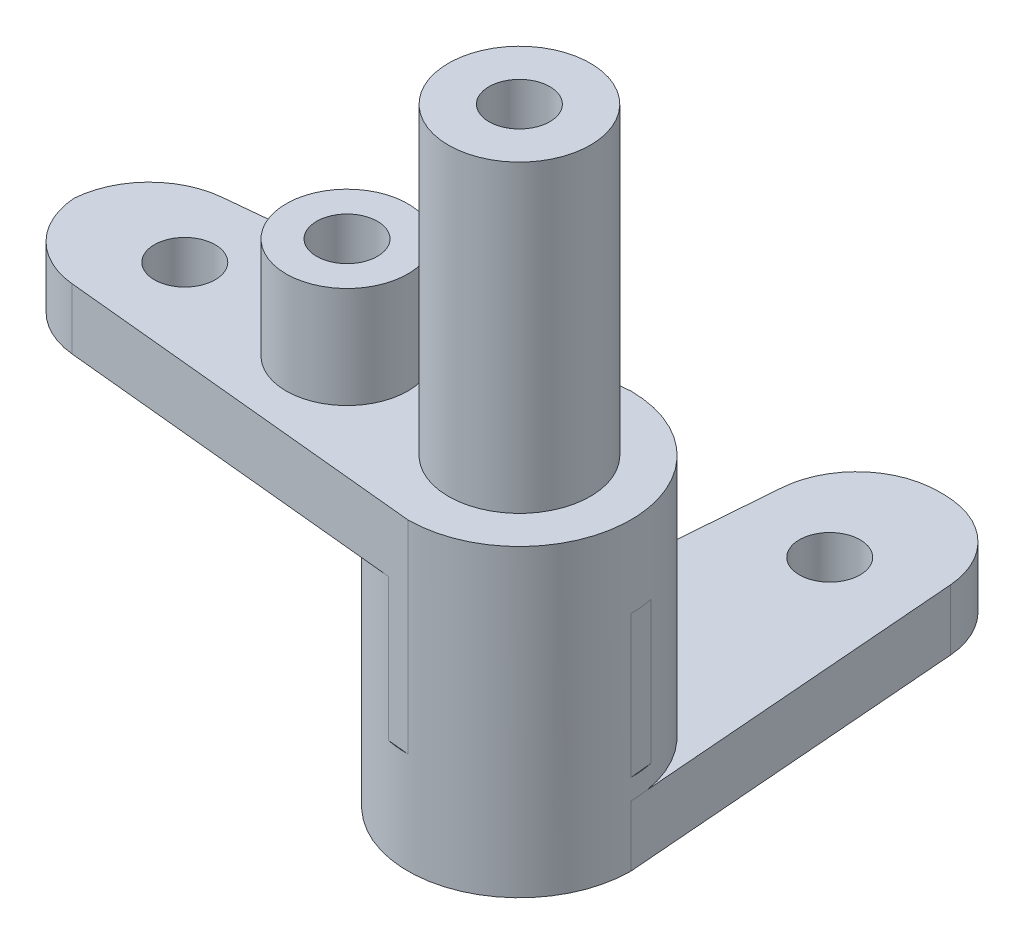
ISO-10303-21;
HEADER;
FILE_DESCRIPTION(('STEP AP214'),'2;1');
FILE_NAME('part.step','',(''),(''),'','','');
FILE_SCHEMA(('AUTOMOTIVE_DESIGN { 1 0 10303 214 1 1 1 1 }'));
ENDSEC;
DATA;
#1=APPLICATION_CONTEXT('core data for automotive mechanical design processes');
#2=APPLICATION_PROTOCOL_DEFINITION('international standard','automotive_design',2000,#1);
#3=PRODUCT_CONTEXT('',#1,'mechanical');
#4=PRODUCT('Part','Part','',(#3));
#5=PRODUCT_RELATED_PRODUCT_CATEGORY('part','',(#4));
#6=PRODUCT_DEFINITION_FORMATION('','',#4);
#7=PRODUCT_DEFINITION_CONTEXT('part definition',#1,'design');
#8=PRODUCT_DEFINITION('design','',#6,#7);
#9=PRODUCT_DEFINITION_SHAPE('','',#8);
#10=(LENGTH_UNIT() NAMED_UNIT(*) SI_UNIT(.MILLI.,.METRE.));
#11=(NAMED_UNIT(*) PLANE_ANGLE_UNIT() SI_UNIT($,.RADIAN.));
#12=(NAMED_UNIT(*) SI_UNIT($,.STERADIAN.) SOLID_ANGLE_UNIT());
#13=UNCERTAINTY_MEASURE_WITH_UNIT(LENGTH_MEASURE(1.E-05),#10,'distance_accuracy_value','');
#14=(GEOMETRIC_REPRESENTATION_CONTEXT(3) GLOBAL_UNCERTAINTY_ASSIGNED_CONTEXT((#13)) GLOBAL_UNIT_ASSIGNED_CONTEXT((#10,
#11,#12)) REPRESENTATION_CONTEXT('',''));
#15=CARTESIAN_POINT('',(0.,0.,0.));
#16=DIRECTION('',(0.,0.,1.));
#17=DIRECTION('',(1.,0.,0.));
#18=AXIS2_PLACEMENT_3D('',#15,#16,#17);
#19=CARTESIAN_POINT('',(16.5,18.,0.));
#20=DIRECTION('',(0.,-1.,0.));
#21=DIRECTION('',(0.,0.,-1.));
#22=AXIS2_PLACEMENT_3D('',#19,#20,#21);
#23=CYLINDRICAL_SURFACE('',#22,2.);
#24=CARTESIAN_POINT('',(16.5,-8.,0.));
#25=DIRECTION('',(0.,-1.,0.));
#26=DIRECTION('',(0.,0.,-1.));
#27=AXIS2_PLACEMENT_3D('',#24,#25,#26);
#28=CIRCLE('',#27,2.);
#29=CARTESIAN_POINT('',(16.5,-8.,-2.));
#30=VERTEX_POINT('',#29);
#31=EDGE_CURVE('E186',#30,#30,#28,.T.);
#32=ORIENTED_EDGE('',*,*,#31,.T.);
#33=EDGE_LOOP('',(#32));
#34=FACE_BOUND('',#33,.T.);
#35=CARTESIAN_POINT('',(16.5,-3.,0.));
#36=DIRECTION('',(0.,1.,0.));
#37=DIRECTION('',(0.,0.,1.));
#38=AXIS2_PLACEMENT_3D('',#35,#36,#37);
#39=CIRCLE('',#38,2.);
#40=CARTESIAN_POINT('',(16.5,-3.,2.));
#41=VERTEX_POINT('',#40);
#42=EDGE_CURVE('E307',#41,#41,#39,.T.);
#43=ORIENTED_EDGE('',*,*,#42,.T.);
#44=EDGE_LOOP('',(#43));
#45=FACE_BOUND('',#44,.T.);
#46=ADVANCED_FACE('F34',(#34,#45),#23,.F.);
#47=CARTESIAN_POINT('',(16.5,3.,0.));
#48=DIRECTION('',(0.,-1.,0.));
#49=DIRECTION('',(0.,0.,-1.));
#50=AXIS2_PLACEMENT_3D('',#47,#48,#49);
#51=CYLINDRICAL_SURFACE('',#50,5.5);
#52=CARTESIAN_POINT('',(16.5,0.,0.));
#53=DIRECTION('',(0.,-1.,0.));
#54=DIRECTION('',(0.,0.,-1.));
#55=AXIS2_PLACEMENT_3D('',#52,#53,#54);
#56=CIRCLE('',#55,5.5);
#57=CARTESIAN_POINT('',(15.4289330513084,0.,5.39470254892895));
#58=VERTEX_POINT('',#57);
#59=CARTESIAN_POINT('',(15.4289330513085,0.,-5.39470254892896));
#60=VERTEX_POINT('',#59);
#61=EDGE_CURVE('E174',#58,#60,#56,.T.);
#62=ORIENTED_EDGE('',*,*,#61,.T.);
#63=DIRECTION('',(0.,-1.,0.));
#64=VECTOR('',#63,1.);
#65=CARTESIAN_POINT('',(15.4289330513085,3.,-5.39470254892896));
#66=LINE('',#65,#64);
#67=CARTESIAN_POINT('',(15.4289330513085,-7.,-5.39470254892896));
#68=VERTEX_POINT('',#67);
#69=EDGE_CURVE('E177',#60,#68,#66,.T.);
#70=ORIENTED_EDGE('',*,*,#69,.T.);
#71=CARTESIAN_POINT('',(16.5,-7.,0.));
#72=DIRECTION('',(0.,1.,0.));
#73=DIRECTION('',(0.,0.,1.));
#74=AXIS2_PLACEMENT_3D('',#71,#72,#73);
#75=CIRCLE('',#74,5.5);
#76=CARTESIAN_POINT('',(16.5,-7.,-5.5));
#77=VERTEX_POINT('',#76);
#78=EDGE_CURVE('E686',#77,#68,#75,.T.);
#79=ORIENTED_EDGE('',*,*,#78,.F.);
#80=DIRECTION('',(0.,-1.,0.));
#81=VECTOR('',#80,1.);
#82=CARTESIAN_POINT('',(16.5,3.,-5.5));
#83=LINE('',#82,#81);
#84=CARTESIAN_POINT('',(16.5,3.,-5.5));
#85=VERTEX_POINT('',#84);
#86=EDGE_CURVE('E656',#85,#77,#83,.T.);
#87=ORIENTED_EDGE('',*,*,#86,.F.);
#88=CARTESIAN_POINT('',(16.5,3.,0.));
#89=DIRECTION('',(0.,1.,0.));
#90=DIRECTION('',(0.,0.,1.));
#91=AXIS2_PLACEMENT_3D('',#88,#89,#90);
#92=CIRCLE('',#91,5.5);
#93=CARTESIAN_POINT('',(16.5000000000001,3.,5.5));
#94=VERTEX_POINT('',#93);
#95=EDGE_CURVE('E702',#94,#85,#92,.T.);
#96=ORIENTED_EDGE('',*,*,#95,.F.);
#97=DIRECTION('',(0.,-1.,0.));
#98=VECTOR('',#97,1.);
#99=CARTESIAN_POINT('',(16.5,3.,5.5));
#100=LINE('',#99,#98);
#101=CARTESIAN_POINT('',(16.5000000000001,-7.,5.5));
#102=VERTEX_POINT('',#101);
#103=EDGE_CURVE('E664',#94,#102,#100,.T.);
#104=ORIENTED_EDGE('',*,*,#103,.T.);
#105=CARTESIAN_POINT('',(16.5,-7.,0.));
#106=DIRECTION('',(0.,-1.,0.));
#107=DIRECTION('',(0.,0.,-1.));
#108=AXIS2_PLACEMENT_3D('',#105,#106,#107);
#109=CIRCLE('',#108,5.5);
#110=CARTESIAN_POINT('',(15.4289330513084,-7.,5.39470254892895));
#111=VERTEX_POINT('',#110);
#112=EDGE_CURVE('E661',#102,#111,#109,.T.);
#113=ORIENTED_EDGE('',*,*,#112,.T.);
#114=DIRECTION('',(0.,-1.,0.));
#115=VECTOR('',#114,1.);
#116=CARTESIAN_POINT('',(15.4289330513084,3.,5.39470254892895));
#117=LINE('',#116,#115);
#118=EDGE_CURVE('E660',#111,#58,#117,.F.);
#119=ORIENTED_EDGE('',*,*,#118,.T.);
#120=EDGE_LOOP('',(#62,#70,#79,#87,#96,#104,#113,#119));
#121=FACE_BOUND('',#120,.T.);
#122=DIRECTION('',(0.,-1.,0.));
#123=VECTOR('',#122,1.);
#124=CARTESIAN_POINT('',(21.8909122893975,3.,-1.08998380172522));
#125=LINE('',#124,#123);
#126=CARTESIAN_POINT('',(21.8909122893975,-0.999999999999999,-1.08998380172523));
#127=VERTEX_POINT('',#126);
#128=CARTESIAN_POINT('',(21.8909122893975,-8.,-1.08998380172523));
#129=VERTEX_POINT('',#128);
#130=EDGE_CURVE('E644',#127,#129,#125,.T.);
#131=ORIENTED_EDGE('',*,*,#130,.T.);
#132=CARTESIAN_POINT('',(16.5,-8.,0.));
#133=DIRECTION('',(0.,-1.,0.));
#134=DIRECTION('',(0.,0.,-1.));
#135=AXIS2_PLACEMENT_3D('',#132,#133,#134);
#136=CIRCLE('',#135,5.5);
#137=CARTESIAN_POINT('',(22.,-8.,0.));
#138=VERTEX_POINT('',#137);
#139=EDGE_CURVE('E179',#129,#138,#136,.T.);
#140=ORIENTED_EDGE('',*,*,#139,.T.);
#141=DIRECTION('',(0.,1.,0.));
#142=VECTOR('',#141,1.);
#143=CARTESIAN_POINT('',(22.,-11.,0.));
#144=LINE('',#143,#142);
#145=CARTESIAN_POINT('',(22.,-0.999999999999999,0.));
#146=VERTEX_POINT('',#145);
#147=EDGE_CURVE('E651',#138,#146,#144,.T.);
#148=ORIENTED_EDGE('',*,*,#147,.T.);
#149=CARTESIAN_POINT('',(16.5,-0.999999999999999,0.));
#150=DIRECTION('',(0.,-1.,0.));
#151=DIRECTION('',(0.,0.,-1.));
#152=AXIS2_PLACEMENT_3D('',#149,#150,#151);
#153=CIRCLE('',#152,5.5);
#154=EDGE_CURVE('E647',#127,#146,#153,.T.);
#155=ORIENTED_EDGE('',*,*,#154,.F.);
#156=EDGE_LOOP('',(#131,#140,#148,#155));
#157=FACE_BOUND('',#156,.T.);
#158=CARTESIAN_POINT('',(16.5,-9.,0.));
#159=DIRECTION('',(0.,-1.,0.));
#160=DIRECTION('',(0.,0.,-1.));
#161=AXIS2_PLACEMENT_3D('',#158,#159,#160);
#162=CIRCLE('',#161,5.5);
#163=CARTESIAN_POINT('',(11.,-9.,0.));
#164=VERTEX_POINT('',#163);
#165=CARTESIAN_POINT('',(11.0679065061099,-9.,-0.861603315706673));
#166=VERTEX_POINT('',#165);
#167=EDGE_CURVE('E165',#164,#166,#162,.T.);
#168=ORIENTED_EDGE('',*,*,#167,.F.);
#169=DIRECTION('',(0.,1.,0.));
#170=VECTOR('',#169,1.);
#171=CARTESIAN_POINT('',(11.,-11.,0.));
#172=LINE('',#171,#170);
#173=CARTESIAN_POINT('',(11.,-12.,0.));
#174=VERTEX_POINT('',#173);
#175=EDGE_CURVE('E150',#174,#164,#172,.T.);
#176=ORIENTED_EDGE('',*,*,#175,.F.);
#177=CARTESIAN_POINT('',(16.5,-12.,0.));
#178=DIRECTION('',(0.,-1.,0.));
#179=DIRECTION('',(0.,0.,-1.));
#180=AXIS2_PLACEMENT_3D('',#177,#178,#179);
#181=CIRCLE('',#180,5.5);
#182=CARTESIAN_POINT('',(22.,-12.,0.));
#183=VERTEX_POINT('',#182);
#184=EDGE_CURVE('E284',#183,#174,#181,.T.);
#185=ORIENTED_EDGE('',*,*,#184,.F.);
#186=DIRECTION('',(0.,1.,0.));
#187=VECTOR('',#186,1.);
#188=CARTESIAN_POINT('',(22.,-11.,0.));
#189=LINE('',#188,#187);
#190=CARTESIAN_POINT('',(22.,-9.,0.));
#191=VERTEX_POINT('',#190);
#192=EDGE_CURVE('E161',#183,#191,#189,.T.);
#193=ORIENTED_EDGE('',*,*,#192,.T.);
#194=CARTESIAN_POINT('',(16.5,-9.,0.));
#195=DIRECTION('',(0.,1.,0.));
#196=DIRECTION('',(0.,0.,1.));
#197=AXIS2_PLACEMENT_3D('',#194,#195,#196);
#198=CIRCLE('',#197,5.5);
#199=CARTESIAN_POINT('',(21.9320934938901,-9.,-0.861603315706648));
#200=VERTEX_POINT('',#199);
#201=EDGE_CURVE('E297',#191,#200,#198,.T.);
#202=ORIENTED_EDGE('',*,*,#201,.T.);
#203=EDGE_CURVE('E173',#166,#200,#162,.T.);
#204=ORIENTED_EDGE('',*,*,#203,.F.);
#205=EDGE_LOOP('',(#168,#176,#185,#193,#202,#204));
#206=FACE_BOUND('',#205,.T.);
#207=ADVANCED_FACE('F170',(#121,#157,#206),#51,.T.);
#208=CARTESIAN_POINT('',(22.,-0.999999999999999,0.));
#209=DIRECTION('',(-0.995029112840307,0.,0.0995844596321667));
#210=DIRECTION('',(0.0995844596321667,0.,0.995029112840307));
#211=AXIS2_PLACEMENT_3D('',#208,#209,#210);
#212=PLANE('',#211);
#213=DIRECTION('',(0.0995844596321667,0.,0.995029112840307));
#214=VECTOR('',#213,1.);
#215=CARTESIAN_POINT('',(22.,-8.,0.));
#216=LINE('',#215,#214);
#217=EDGE_CURVE('E265',#129,#138,#216,.T.);
#218=ORIENTED_EDGE('',*,*,#217,.F.);
#219=ORIENTED_EDGE('',*,*,#130,.F.);
#220=DIRECTION('',(-0.0995844596321667,0.,-0.995029112840307));
#221=VECTOR('',#220,1.);
#222=CARTESIAN_POINT('',(22.,-0.999999999999999,0.));
#223=LINE('',#222,#221);
#224=EDGE_CURVE('E675',#146,#127,#223,.T.);
#225=ORIENTED_EDGE('',*,*,#224,.F.);
#226=ORIENTED_EDGE('',*,*,#147,.F.);
#227=EDGE_LOOP('',(#218,#219,#225,#226));
#228=FACE_BOUND('',#227,.T.);
#229=ADVANCED_FACE('F232',(#228),#212,.F.);
#230=CARTESIAN_POINT('',(0.,3.,0.));
#231=DIRECTION('',(0.,1.,0.));
#232=DIRECTION('',(0.,0.,1.));
#233=AXIS2_PLACEMENT_3D('',#230,#231,#232);
#234=PLANE('',#233);
#235=DIRECTION('',(0.99520224298787,0.,-0.097839130985065));
#236=VECTOR('',#235,1.);
#237=CARTESIAN_POINT('',(16.5,3.,-5.5));
#238=LINE('',#237,#236);
#239=CARTESIAN_POINT('',(-1.86380585767021,3.,-3.69463951236814));
#240=VERTEX_POINT('',#239);
#241=EDGE_CURVE('E676',#240,#85,#238,.T.);
#242=ORIENTED_EDGE('',*,*,#241,.F.);
#243=CARTESIAN_POINT('',(-1.47244933372995,3.,0.286169459583339));
#244=DIRECTION('',(0.,1.,0.));
#245=DIRECTION('',(0.,0.,1.));
#246=AXIS2_PLACEMENT_3D('',#243,#244,#245);
#247=CIRCLE('',#246,4.);
#248=CARTESIAN_POINT('',(-5.46219958160284,3.,0.));
#249=VERTEX_POINT('',#248);
#250=EDGE_CURVE('E650',#240,#249,#247,.T.);
#251=ORIENTED_EDGE('',*,*,#250,.T.);
#252=CARTESIAN_POINT('',(-1.47244933372995,3.,-0.28616945958334));
#253=DIRECTION('',(0.,1.,0.));
#254=DIRECTION('',(0.,0.,1.));
#255=AXIS2_PLACEMENT_3D('',#252,#253,#254);
#256=CIRCLE('',#255,4.);
#257=CARTESIAN_POINT('',(-1.86380585767021,3.,3.69463951236814));
#258=VERTEX_POINT('',#257);
#259=EDGE_CURVE('E689',#249,#258,#256,.T.);
#260=ORIENTED_EDGE('',*,*,#259,.T.);
#261=DIRECTION('',(-0.99520224298787,0.,-0.0978391309850647));
#262=VECTOR('',#261,1.);
#263=CARTESIAN_POINT('',(16.5000000000001,3.,5.5));
#264=LINE('',#263,#262);
#265=EDGE_CURVE('E669',#94,#258,#264,.T.);
#266=ORIENTED_EDGE('',*,*,#265,.F.);
#267=ORIENTED_EDGE('',*,*,#95,.T.);
#268=EDGE_LOOP('',(#242,#251,#260,#266,#267));
#269=FACE_BOUND('',#268,.T.);
#270=CARTESIAN_POINT('',(8.,3.,0.));
#271=DIRECTION('',(0.,1.,0.));
#272=DIRECTION('',(0.,0.,1.));
#273=AXIS2_PLACEMENT_3D('',#270,#271,#272);
#274=CIRCLE('',#273,3.);
#275=CARTESIAN_POINT('',(8.,3.,3.));
#276=VERTEX_POINT('',#275);
#277=EDGE_CURVE('E714',#276,#276,#274,.T.);
#278=ORIENTED_EDGE('',*,*,#277,.F.);
#279=EDGE_LOOP('',(#278));
#280=FACE_BOUND('',#279,.T.);
#281=CARTESIAN_POINT('',(16.5,3.,0.));
#282=DIRECTION('',(0.,1.,0.));
#283=DIRECTION('',(0.,0.,1.));
#284=AXIS2_PLACEMENT_3D('',#281,#282,#283);
#285=CIRCLE('',#284,3.5);
#286=CARTESIAN_POINT('',(16.5,3.,3.5));
#287=VERTEX_POINT('',#286);
#288=EDGE_CURVE('E711',#287,#287,#285,.T.);
#289=ORIENTED_EDGE('',*,*,#288,.F.);
#290=EDGE_LOOP('',(#289));
#291=FACE_BOUND('',#290,.T.);
#292=CARTESIAN_POINT('',(0.,3.,0.));
#293=DIRECTION('',(0.,1.,0.));
#294=DIRECTION('',(0.,0.,1.));
#295=AXIS2_PLACEMENT_3D('',#292,#293,#294);
#296=CIRCLE('',#295,1.5);
#297=CARTESIAN_POINT('',(0.,3.,1.5));
#298=VERTEX_POINT('',#297);
#299=EDGE_CURVE('E705',#298,#298,#296,.T.);
#300=ORIENTED_EDGE('',*,*,#299,.F.);
#301=EDGE_LOOP('',(#300));
#302=FACE_BOUND('',#301,.T.);
#303=ADVANCED_FACE('F228',(#269,#280,#291,#302),#234,.T.);
#304=CARTESIAN_POINT('',(0.,0.,0.));
#305=DIRECTION('',(0.,1.,0.));
#306=DIRECTION('',(0.,0.,1.));
#307=AXIS2_PLACEMENT_3D('',#304,#305,#306);
#308=PLANE('',#307);
#309=CARTESIAN_POINT('',(-1.47244933372995,0.,-0.28616945958334));
#310=DIRECTION('',(0.,1.,0.));
#311=DIRECTION('',(0.,0.,1.));
#312=AXIS2_PLACEMENT_3D('',#309,#310,#311);
#313=CIRCLE('',#312,4.);
#314=CARTESIAN_POINT('',(-1.86380585767021,0.,3.69463951236814));
#315=VERTEX_POINT('',#314);
#316=CARTESIAN_POINT('',(-5.46219958160284,0.,0.));
#317=VERTEX_POINT('',#316);
#318=EDGE_CURVE('E704',#315,#317,#313,.F.);
#319=ORIENTED_EDGE('',*,*,#318,.T.);
#320=CARTESIAN_POINT('',(-1.47244933372995,0.,0.286169459583339));
#321=DIRECTION('',(0.,1.,0.));
#322=DIRECTION('',(0.,0.,1.));
#323=AXIS2_PLACEMENT_3D('',#320,#321,#322);
#324=CIRCLE('',#323,4.);
#325=CARTESIAN_POINT('',(-1.86380585767021,0.,-3.69463951236814));
#326=VERTEX_POINT('',#325);
#327=EDGE_CURVE('E695',#317,#326,#324,.F.);
#328=ORIENTED_EDGE('',*,*,#327,.T.);
#329=DIRECTION('',(0.99520224298787,0.,-0.097839130985065));
#330=VECTOR('',#329,1.);
#331=CARTESIAN_POINT('',(-0.377587297739204,0.,-3.84075085142719));
#332=LINE('',#331,#330);
#333=EDGE_CURVE('E692',#326,#60,#332,.T.);
#334=ORIENTED_EDGE('',*,*,#333,.T.);
#335=ORIENTED_EDGE('',*,*,#61,.F.);
#336=DIRECTION('',(-0.99520224298787,0.,-0.0978391309850647));
#337=VECTOR('',#336,1.);
#338=CARTESIAN_POINT('',(-0.377587297739203,0.,3.84075085142719));
#339=LINE('',#338,#337);
#340=EDGE_CURVE('E694',#58,#315,#339,.T.);
#341=ORIENTED_EDGE('',*,*,#340,.T.);
#342=EDGE_LOOP('',(#319,#328,#334,#335,#341));
#343=FACE_BOUND('',#342,.T.);
#344=CARTESIAN_POINT('',(0.,0.,0.));
#345=DIRECTION('',(0.,1.,0.));
#346=DIRECTION('',(0.,0.,1.));
#347=AXIS2_PLACEMENT_3D('',#344,#345,#346);
#348=CIRCLE('',#347,1.5);
#349=CARTESIAN_POINT('',(0.,0.,1.5));
#350=VERTEX_POINT('',#349);
#351=EDGE_CURVE('E698',#350,#350,#348,.T.);
#352=ORIENTED_EDGE('',*,*,#351,.T.);
#353=EDGE_LOOP('',(#352));
#354=FACE_BOUND('',#353,.T.);
#355=ADVANCED_FACE('F224',(#343,#354),#308,.F.);
#356=CARTESIAN_POINT('',(0.,0.,0.));
#357=DIRECTION('',(0.,1.,0.));
#358=DIRECTION('',(0.,0.,1.));
#359=AXIS2_PLACEMENT_3D('',#356,#357,#358);
#360=CYLINDRICAL_SURFACE('',#359,1.5);
#361=ORIENTED_EDGE('',*,*,#351,.F.);
#362=EDGE_LOOP('',(#361));
#363=FACE_BOUND('',#362,.T.);
#364=ORIENTED_EDGE('',*,*,#299,.T.);
#365=EDGE_LOOP('',(#364));
#366=FACE_BOUND('',#365,.T.);
#367=ADVANCED_FACE('F227',(#363,#366),#360,.F.);
#368=CARTESIAN_POINT('',(16.5,18.,0.));
#369=DIRECTION('',(0.,1.,0.));
#370=DIRECTION('',(0.,0.,1.));
#371=AXIS2_PLACEMENT_3D('',#368,#369,#370);
#372=PLANE('',#371);
#373=CARTESIAN_POINT('',(16.5,18.,0.));
#374=DIRECTION('',(0.,1.,0.));
#375=DIRECTION('',(0.,0.,1.));
#376=AXIS2_PLACEMENT_3D('',#373,#374,#375);
#377=CIRCLE('',#376,3.5);
#378=CARTESIAN_POINT('',(16.5,18.,3.5));
#379=VERTEX_POINT('',#378);
#380=EDGE_CURVE('E708',#379,#379,#377,.T.);
#381=ORIENTED_EDGE('',*,*,#380,.T.);
#382=EDGE_LOOP('',(#381));
#383=FACE_BOUND('',#382,.T.);
#384=CARTESIAN_POINT('',(16.5,18.,0.));
#385=DIRECTION('',(0.,1.,0.));
#386=DIRECTION('',(0.,0.,1.));
#387=AXIS2_PLACEMENT_3D('',#384,#385,#386);
#388=CIRCLE('',#387,1.5);
#389=CARTESIAN_POINT('',(16.5,18.,1.5));
#390=VERTEX_POINT('',#389);
#391=EDGE_CURVE('E316',#390,#390,#388,.T.);
#392=ORIENTED_EDGE('',*,*,#391,.F.);
#393=EDGE_LOOP('',(#392));
#394=FACE_BOUND('',#393,.T.);
#395=ADVANCED_FACE('F236',(#383,#394),#372,.T.);
#396=CARTESIAN_POINT('',(16.5,18.,0.));
#397=DIRECTION('',(0.,-1.,0.));
#398=DIRECTION('',(0.,0.,-1.));
#399=AXIS2_PLACEMENT_3D('',#396,#397,#398);
#400=CYLINDRICAL_SURFACE('',#399,3.5);
#401=ORIENTED_EDGE('',*,*,#380,.F.);
#402=EDGE_LOOP('',(#401));
#403=FACE_BOUND('',#402,.T.);
#404=ORIENTED_EDGE('',*,*,#288,.T.);
#405=EDGE_LOOP('',(#404));
#406=FACE_BOUND('',#405,.T.);
#407=ADVANCED_FACE('F238',(#403,#406),#400,.T.);
#408=CARTESIAN_POINT('',(8.,8.,0.));
#409=DIRECTION('',(0.,-1.,0.));
#410=DIRECTION('',(0.,0.,-1.));
#411=AXIS2_PLACEMENT_3D('',#408,#409,#410);
#412=CYLINDRICAL_SURFACE('',#411,3.);
#413=CARTESIAN_POINT('',(8.,8.,0.));
#414=DIRECTION('',(0.,1.,0.));
#415=DIRECTION('',(0.,0.,1.));
#416=AXIS2_PLACEMENT_3D('',#413,#414,#415);
#417=CIRCLE('',#416,3.);
#418=CARTESIAN_POINT('',(8.,8.,3.));
#419=VERTEX_POINT('',#418);
#420=EDGE_CURVE('E719',#419,#419,#417,.T.);
#421=ORIENTED_EDGE('',*,*,#420,.F.);
#422=EDGE_LOOP('',(#421));
#423=FACE_BOUND('',#422,.T.);
#424=ORIENTED_EDGE('',*,*,#277,.T.);
#425=EDGE_LOOP('',(#424));
#426=FACE_BOUND('',#425,.T.);
#427=ADVANCED_FACE('F241',(#423,#426),#412,.T.);
#428=CARTESIAN_POINT('',(8.,8.,0.));
#429=DIRECTION('',(0.,1.,0.));
#430=DIRECTION('',(0.,0.,1.));
#431=AXIS2_PLACEMENT_3D('',#428,#429,#430);
#432=PLANE('',#431);
#433=CARTESIAN_POINT('',(8.,8.,0.));
#434=DIRECTION('',(0.,1.,0.));
#435=DIRECTION('',(0.,0.,1.));
#436=AXIS2_PLACEMENT_3D('',#433,#434,#435);
#437=CIRCLE('',#436,1.5);
#438=CARTESIAN_POINT('',(8.,8.,1.5));
#439=VERTEX_POINT('',#438);
#440=EDGE_CURVE('E722',#439,#439,#437,.T.);
#441=ORIENTED_EDGE('',*,*,#440,.F.);
#442=EDGE_LOOP('',(#441));
#443=FACE_BOUND('',#442,.T.);
#444=ORIENTED_EDGE('',*,*,#420,.T.);
#445=EDGE_LOOP('',(#444));
#446=FACE_BOUND('',#445,.T.);
#447=ADVANCED_FACE('F500',(#443,#446),#432,.T.);
#448=CARTESIAN_POINT('',(8.,2.,0.));
#449=DIRECTION('',(0.,1.,0.));
#450=DIRECTION('',(0.,0.,1.));
#451=AXIS2_PLACEMENT_3D('',#448,#449,#450);
#452=CYLINDRICAL_SURFACE('',#451,1.5);
#453=CARTESIAN_POINT('',(8.,2.,0.));
#454=DIRECTION('',(0.,1.,0.));
#455=DIRECTION('',(0.,0.,1.));
#456=AXIS2_PLACEMENT_3D('',#453,#454,#455);
#457=CIRCLE('',#456,1.5);
#458=CARTESIAN_POINT('',(8.,2.,1.5));
#459=VERTEX_POINT('',#458);
#460=EDGE_CURVE('E700',#459,#459,#457,.T.);
#461=ORIENTED_EDGE('',*,*,#460,.F.);
#462=EDGE_LOOP('',(#461));
#463=FACE_BOUND('',#462,.T.);
#464=ORIENTED_EDGE('',*,*,#440,.T.);
#465=EDGE_LOOP('',(#464));
#466=FACE_BOUND('',#465,.T.);
#467=ADVANCED_FACE('F492',(#463,#466),#452,.F.);
#468=CARTESIAN_POINT('',(8.,2.,0.));
#469=DIRECTION('',(0.,1.,0.));
#470=DIRECTION('',(0.,0.,1.));
#471=AXIS2_PLACEMENT_3D('',#468,#469,#470);
#472=PLANE('',#471);
#473=ORIENTED_EDGE('',*,*,#460,.T.);
#474=EDGE_LOOP('',(#473));
#475=FACE_BOUND('',#474,.T.);
#476=ADVANCED_FACE('F484',(#475),#472,.T.);
#477=CARTESIAN_POINT('',(16.4999999999999,-0.999999999999999,-15.2999999999999));
#478=DIRECTION('',(0.,-1.,0.));
#479=DIRECTION('',(0.,0.,-1.));
#480=AXIS2_PLACEMENT_3D('',#477,#478,#479);
#481=PLANE('',#480);
#482=ORIENTED_EDGE('',*,*,#154,.T.);
#483=ORIENTED_EDGE('',*,*,#224,.T.);
#484=EDGE_LOOP('',(#482,#483));
#485=FACE_BOUND('',#484,.T.);
#486=ADVANCED_FACE('F476',(#485),#481,.T.);
#487=CARTESIAN_POINT('',(0.,-7.,0.));
#488=DIRECTION('',(0.,-1.,0.));
#489=DIRECTION('',(0.,0.,-1.));
#490=AXIS2_PLACEMENT_3D('',#487,#488,#489);
#491=PLANE('',#490);
#492=DIRECTION('',(-0.99520224298787,0.,-0.0978391309850647));
#493=VECTOR('',#492,1.);
#494=CARTESIAN_POINT('',(16.5000000000001,-7.,5.5));
#495=LINE('',#494,#493);
#496=EDGE_CURVE('E673',#102,#111,#495,.T.);
#497=ORIENTED_EDGE('',*,*,#496,.T.);
#498=ORIENTED_EDGE('',*,*,#112,.F.);
#499=EDGE_LOOP('',(#497,#498));
#500=FACE_BOUND('',#499,.T.);
#501=ADVANCED_FACE('F468',(#500),#491,.F.);
#502=CARTESIAN_POINT('',(16.5000000000001,-7.,5.5));
#503=DIRECTION('',(0.0978391309850647,0.,-0.99520224298787));
#504=DIRECTION('',(-0.99520224298787,0.,-0.0978391309850647));
#505=AXIS2_PLACEMENT_3D('',#502,#503,#504);
#506=PLANE('',#505);
#507=ORIENTED_EDGE('',*,*,#265,.T.);
#508=DIRECTION('',(0.,-1.,0.));
#509=VECTOR('',#508,1.);
#510=CARTESIAN_POINT('',(-1.86380585767021,-7.,3.69463951236814));
#511=LINE('',#510,#509);
#512=EDGE_CURVE('E672',#258,#315,#511,.T.);
#513=ORIENTED_EDGE('',*,*,#512,.T.);
#514=ORIENTED_EDGE('',*,*,#340,.F.);
#515=ORIENTED_EDGE('',*,*,#118,.F.);
#516=ORIENTED_EDGE('',*,*,#496,.F.);
#517=ORIENTED_EDGE('',*,*,#103,.F.);
#518=EDGE_LOOP('',(#507,#513,#514,#515,#516,#517));
#519=FACE_BOUND('',#518,.T.);
#520=ADVANCED_FACE('F460',(#519),#506,.F.);
#521=CARTESIAN_POINT('',(0.,-7.,0.));
#522=DIRECTION('',(0.,1.,0.));
#523=DIRECTION('',(0.,0.,1.));
#524=AXIS2_PLACEMENT_3D('',#521,#522,#523);
#525=PLANE('',#524);
#526=ORIENTED_EDGE('',*,*,#78,.T.);
#527=DIRECTION('',(0.99520224298787,0.,-0.097839130985065));
#528=VECTOR('',#527,1.);
#529=CARTESIAN_POINT('',(16.5,-7.,-5.5));
#530=LINE('',#529,#528);
#531=EDGE_CURVE('E658',#68,#77,#530,.T.);
#532=ORIENTED_EDGE('',*,*,#531,.T.);
#533=EDGE_LOOP('',(#526,#532));
#534=FACE_BOUND('',#533,.T.);
#535=ADVANCED_FACE('F452',(#534),#525,.T.);
#536=CARTESIAN_POINT('',(16.5,-7.,-5.5));
#537=DIRECTION('',(0.097839130985065,0.,0.99520224298787));
#538=DIRECTION('',(0.99520224298787,0.,-0.097839130985065));
#539=AXIS2_PLACEMENT_3D('',#536,#537,#538);
#540=PLANE('',#539);
#541=ORIENTED_EDGE('',*,*,#333,.F.);
#542=DIRECTION('',(0.,-1.,0.));
#543=VECTOR('',#542,1.);
#544=CARTESIAN_POINT('',(-1.86380585767022,-7.,-3.69463951236814));
#545=LINE('',#544,#543);
#546=EDGE_CURVE('E677',#326,#240,#545,.F.);
#547=ORIENTED_EDGE('',*,*,#546,.T.);
#548=ORIENTED_EDGE('',*,*,#241,.T.);
#549=ORIENTED_EDGE('',*,*,#86,.T.);
#550=ORIENTED_EDGE('',*,*,#531,.F.);
#551=ORIENTED_EDGE('',*,*,#69,.F.);
#552=EDGE_LOOP('',(#541,#547,#548,#549,#550,#551));
#553=FACE_BOUND('',#552,.T.);
#554=ADVANCED_FACE('F219',(#553),#540,.F.);
#555=CARTESIAN_POINT('',(-1.47244933372995,3.,-0.28616945958334));
#556=DIRECTION('',(0.,-1.,0.));
#557=DIRECTION('',(0.,0.,-1.));
#558=AXIS2_PLACEMENT_3D('',#555,#556,#557);
#559=CYLINDRICAL_SURFACE('',#558,4.);
#560=DIRECTION('',(0.,-1.,0.));
#561=VECTOR('',#560,1.);
#562=CARTESIAN_POINT('',(-5.46219958160284,1.5,0.));
#563=LINE('',#562,#561);
#564=EDGE_CURVE('E195',#317,#249,#563,.F.);
#565=ORIENTED_EDGE('',*,*,#564,.F.);
#566=ORIENTED_EDGE('',*,*,#318,.F.);
#567=ORIENTED_EDGE('',*,*,#512,.F.);
#568=ORIENTED_EDGE('',*,*,#259,.F.);
#569=EDGE_LOOP('',(#565,#566,#567,#568));
#570=FACE_BOUND('',#569,.T.);
#571=ADVANCED_FACE('F216',(#570),#559,.T.);
#572=CARTESIAN_POINT('',(-1.47244933372995,3.,0.286169459583339));
#573=DIRECTION('',(0.,-1.,0.));
#574=DIRECTION('',(0.,0.,-1.));
#575=AXIS2_PLACEMENT_3D('',#572,#573,#574);
#576=CYLINDRICAL_SURFACE('',#575,4.);
#577=ORIENTED_EDGE('',*,*,#327,.F.);
#578=ORIENTED_EDGE('',*,*,#564,.T.);
#579=ORIENTED_EDGE('',*,*,#250,.F.);
#580=ORIENTED_EDGE('',*,*,#546,.F.);
#581=EDGE_LOOP('',(#577,#578,#579,#580));
#582=FACE_BOUND('',#581,.T.);
#583=ADVANCED_FACE('F214',(#582),#576,.T.);
#584=CARTESIAN_POINT('',(16.5,-8.,0.));
#585=DIRECTION('',(0.,-1.,0.));
#586=DIRECTION('',(0.,0.,-1.));
#587=AXIS2_PLACEMENT_3D('',#584,#585,#586);
#588=PLANE('',#587);
#589=ORIENTED_EDGE('',*,*,#139,.F.);
#590=ORIENTED_EDGE('',*,*,#217,.T.);
#591=EDGE_LOOP('',(#589,#590));
#592=FACE_BOUND('',#591,.T.);
#593=ADVANCED_FACE('F208',(#592),#588,.F.);
#594=CARTESIAN_POINT('',(16.5,-9.,0.));
#595=DIRECTION('',(0.,1.,0.));
#596=DIRECTION('',(0.,0.,1.));
#597=AXIS2_PLACEMENT_3D('',#594,#595,#596);
#598=CYLINDRICAL_SURFACE('',#597,1.99608525989503);
#599=CARTESIAN_POINT('',(16.5,-9.,0.));
#600=DIRECTION('',(0.,-1.,0.));
#601=DIRECTION('',(0.,0.,-1.));
#602=AXIS2_PLACEMENT_3D('',#599,#600,#601);
#603=CIRCLE('',#602,1.99608525989503);
#604=CARTESIAN_POINT('',(16.5,-9.,-1.99608525989503));
#605=VERTEX_POINT('',#604);
#606=EDGE_CURVE('E182',#605,#605,#603,.T.);
#607=ORIENTED_EDGE('',*,*,#606,.T.);
#608=EDGE_LOOP('',(#607));
#609=FACE_BOUND('',#608,.T.);
#610=ORIENTED_EDGE('',*,*,#31,.F.);
#611=EDGE_LOOP('',(#610));
#612=FACE_BOUND('',#611,.T.);
#613=ADVANCED_FACE('F197',(#609,#612),#598,.F.);
#614=CARTESIAN_POINT('',(-2.,-9.,5.5));
#615=DIRECTION('',(0.,-1.,0.));
#616=DIRECTION('',(0.,0.,-1.));
#617=AXIS2_PLACEMENT_3D('',#614,#615,#616);
#618=PLANE('',#617);
#619=CARTESIAN_POINT('',(16.5,-9.,0.));
#620=DIRECTION('',(0.,-1.,0.));
#621=DIRECTION('',(0.,0.,-1.));
#622=AXIS2_PLACEMENT_3D('',#619,#620,#621);
#623=CIRCLE('',#622,1.5);
#624=CARTESIAN_POINT('',(16.5,-9.,-1.5));
#625=VERTEX_POINT('',#624);
#626=EDGE_CURVE('E313',#625,#625,#623,.T.);
#627=ORIENTED_EDGE('',*,*,#626,.T.);
#628=EDGE_LOOP('',(#627));
#629=FACE_BOUND('',#628,.T.);
#630=ORIENTED_EDGE('',*,*,#606,.F.);
#631=EDGE_LOOP('',(#630));
#632=FACE_BOUND('',#631,.T.);
#633=ADVANCED_FACE('F207',(#629,#632),#618,.F.);
#634=CARTESIAN_POINT('',(16.5,-9.,-15.3));
#635=DIRECTION('',(0.,1.,0.));
#636=DIRECTION('',(0.,0.,1.));
#637=AXIS2_PLACEMENT_3D('',#634,#635,#636);
#638=CIRCLE('',#637,1.5);
#639=CARTESIAN_POINT('',(16.5,-9.,-13.8));
#640=VERTEX_POINT('',#639);
#641=EDGE_CURVE('E291',#640,#640,#638,.T.);
#642=ORIENTED_EDGE('',*,*,#641,.F.);
#643=EDGE_LOOP('',(#642));
#644=FACE_BOUND('',#643,.T.);
#645=CARTESIAN_POINT('',(16.5,-9.,-15.3));
#646=DIRECTION('',(0.,-1.,0.));
#647=DIRECTION('',(0.,0.,-1.));
#648=AXIS2_PLACEMENT_3D('',#645,#646,#647);
#649=CIRCLE('',#648,5.5);
#650=CARTESIAN_POINT('',(15.8978254781016,-9.,-20.7669356906019));
#651=VERTEX_POINT('',#650);
#652=CARTESIAN_POINT('',(17.1021745218984,-9.,-20.7669356906019));
#653=VERTEX_POINT('',#652);
#654=EDGE_CURVE('E160',#651,#653,#649,.T.);
#655=ORIENTED_EDGE('',*,*,#654,.F.);
#656=CARTESIAN_POINT('',(16.3357705849368,-9.,-16.7909824610732));
#657=DIRECTION('',(0.,-1.,0.));
#658=DIRECTION('',(0.,0.,-1.));
#659=AXIS2_PLACEMENT_3D('',#656,#657,#658);
#660=CIRCLE('',#659,4.);
#661=CARTESIAN_POINT('',(12.3481363363874,-9.,-17.1052643405958));
#662=VERTEX_POINT('',#661);
#663=EDGE_CURVE('E270',#651,#662,#660,.F.);
#664=ORIENTED_EDGE('',*,*,#663,.T.);
#665=DIRECTION('',(0.0785704698806366,0.,-0.996908562137339));
#666=VECTOR('',#665,1.);
#667=CARTESIAN_POINT('',(11.,-9.,0.));
#668=LINE('',#667,#666);
#669=EDGE_CURVE('E167',#166,#662,#668,.T.);
#670=ORIENTED_EDGE('',*,*,#669,.F.);
#671=ORIENTED_EDGE('',*,*,#203,.T.);
#672=DIRECTION('',(0.0785704698806362,0.,0.996908562137339));
#673=VECTOR('',#672,1.);
#674=CARTESIAN_POINT('',(22.,-9.,0.));
#675=LINE('',#674,#673);
#676=CARTESIAN_POINT('',(20.6518636636126,-9.,-17.1052643405958));
#677=VERTEX_POINT('',#676);
#678=EDGE_CURVE('E294',#677,#200,#675,.T.);
#679=ORIENTED_EDGE('',*,*,#678,.F.);
#680=CARTESIAN_POINT('',(16.6642294150632,-9.,-16.7909824610732));
#681=DIRECTION('',(0.,-1.,0.));
#682=DIRECTION('',(0.,0.,-1.));
#683=AXIS2_PLACEMENT_3D('',#680,#681,#682);
#684=CIRCLE('',#683,4.);
#685=EDGE_CURVE('E268',#677,#653,#684,.F.);
#686=ORIENTED_EDGE('',*,*,#685,.T.);
#687=EDGE_LOOP('',(#655,#664,#670,#671,#679,#686));
#688=FACE_BOUND('',#687,.T.);
#689=ADVANCED_FACE('F289',(#644,#688),#618,.F.);
#690=CARTESIAN_POINT('',(16.5,-12.,-15.3));
#691=DIRECTION('',(0.,-1.,0.));
#692=DIRECTION('',(0.,0.,-1.));
#693=AXIS2_PLACEMENT_3D('',#690,#691,#692);
#694=PLANE('',#693);
#695=CARTESIAN_POINT('',(16.5,-12.,0.));
#696=DIRECTION('',(0.,-1.,0.));
#697=DIRECTION('',(0.,0.,-1.));
#698=AXIS2_PLACEMENT_3D('',#695,#696,#697);
#699=CIRCLE('',#698,1.5);
#700=CARTESIAN_POINT('',(16.5,-12.,-1.5));
#701=VERTEX_POINT('',#700);
#702=EDGE_CURVE('E309',#701,#701,#699,.T.);
#703=ORIENTED_EDGE('',*,*,#702,.F.);
#704=EDGE_LOOP('',(#703));
#705=FACE_BOUND('',#704,.T.);
#706=CARTESIAN_POINT('',(16.5,-12.,-15.3));
#707=DIRECTION('',(0.,-1.,0.));
#708=DIRECTION('',(0.,0.,-1.));
#709=AXIS2_PLACEMENT_3D('',#706,#707,#708);
#710=CIRCLE('',#709,1.5);
#711=CARTESIAN_POINT('',(16.5,-12.,-16.8));
#712=VERTEX_POINT('',#711);
#713=EDGE_CURVE('E38',#712,#712,#710,.T.);
#714=ORIENTED_EDGE('',*,*,#713,.F.);
#715=EDGE_LOOP('',(#714));
#716=FACE_BOUND('',#715,.T.);
#717=DIRECTION('',(-0.0785704698806366,0.,0.996908562137339));
#718=VECTOR('',#717,1.);
#719=CARTESIAN_POINT('',(12.2323651376289,-12.,-15.6363498811732));
#720=LINE('',#719,#718);
#721=CARTESIAN_POINT('',(12.3481363363874,-12.,-17.1052643405958));
#722=VERTEX_POINT('',#721);
#723=EDGE_CURVE('E155',#722,#174,#720,.T.);
#724=ORIENTED_EDGE('',*,*,#723,.F.);
#725=CARTESIAN_POINT('',(16.3357705849368,-12.,-16.7909824610732));
#726=DIRECTION('',(0.,-1.,0.));
#727=DIRECTION('',(0.,0.,-1.));
#728=AXIS2_PLACEMENT_3D('',#725,#726,#727);
#729=CIRCLE('',#728,4.);
#730=CARTESIAN_POINT('',(15.8978254781016,-12.,-20.7669356906019));
#731=VERTEX_POINT('',#730);
#732=EDGE_CURVE('E43',#722,#731,#729,.T.);
#733=ORIENTED_EDGE('',*,*,#732,.T.);
#734=CARTESIAN_POINT('',(16.5,-12.,-15.3));
#735=DIRECTION('',(0.,-1.,0.));
#736=DIRECTION('',(0.,0.,-1.));
#737=AXIS2_PLACEMENT_3D('',#734,#735,#736);
#738=CIRCLE('',#737,5.5);
#739=CARTESIAN_POINT('',(17.1021745218984,-12.,-20.7669356906019));
#740=VERTEX_POINT('',#739);
#741=EDGE_CURVE('E277',#731,#740,#738,.T.);
#742=ORIENTED_EDGE('',*,*,#741,.T.);
#743=CARTESIAN_POINT('',(16.6642294150632,-12.,-16.7909824610732));
#744=DIRECTION('',(0.,-1.,0.));
#745=DIRECTION('',(0.,0.,-1.));
#746=AXIS2_PLACEMENT_3D('',#743,#744,#745);
#747=CIRCLE('',#746,4.);
#748=CARTESIAN_POINT('',(20.6518636636126,-12.,-17.1052643405958));
#749=VERTEX_POINT('',#748);
#750=EDGE_CURVE('E50',#740,#749,#747,.T.);
#751=ORIENTED_EDGE('',*,*,#750,.T.);
#752=DIRECTION('',(-0.0785704698806362,0.,-0.996908562137339));
#753=VECTOR('',#752,1.);
#754=CARTESIAN_POINT('',(20.7676348623711,-12.,-15.6363498811732));
#755=LINE('',#754,#753);
#756=EDGE_CURVE('E285',#183,#749,#755,.T.);
#757=ORIENTED_EDGE('',*,*,#756,.F.);
#758=ORIENTED_EDGE('',*,*,#184,.T.);
#759=EDGE_LOOP('',(#724,#733,#742,#751,#757,#758));
#760=FACE_BOUND('',#759,.T.);
#761=ADVANCED_FACE('F276',(#705,#716,#760),#694,.T.);
#762=CARTESIAN_POINT('',(16.5,-12.,-15.3));
#763=DIRECTION('',(0.,1.,0.));
#764=DIRECTION('',(0.,0.,1.));
#765=AXIS2_PLACEMENT_3D('',#762,#763,#764);
#766=CYLINDRICAL_SURFACE('',#765,5.5);
#767=ORIENTED_EDGE('',*,*,#741,.F.);
#768=DIRECTION('',(0.,1.,0.));
#769=VECTOR('',#768,1.);
#770=CARTESIAN_POINT('',(15.8978254781016,-12.,-20.7669356906019));
#771=LINE('',#770,#769);
#772=EDGE_CURVE('E264',#731,#651,#771,.T.);
#773=ORIENTED_EDGE('',*,*,#772,.T.);
#774=ORIENTED_EDGE('',*,*,#654,.T.);
#775=DIRECTION('',(0.,1.,0.));
#776=VECTOR('',#775,1.);
#777=CARTESIAN_POINT('',(17.1021745218984,-12.,-20.7669356906019));
#778=LINE('',#777,#776);
#779=EDGE_CURVE('E257',#653,#740,#778,.F.);
#780=ORIENTED_EDGE('',*,*,#779,.T.);
#781=EDGE_LOOP('',(#767,#773,#774,#780));
#782=FACE_BOUND('',#781,.T.);
#783=ADVANCED_FACE('F210',(#782),#766,.T.);
#784=CARTESIAN_POINT('',(0.,-9.,0.));
#785=DIRECTION('',(0.,-1.,0.));
#786=DIRECTION('',(0.,0.,-1.));
#787=AXIS2_PLACEMENT_3D('',#784,#785,#786);
#788=PLANE('',#787);
#789=ORIENTED_EDGE('',*,*,#167,.T.);
#790=EDGE_CURVE('E153',#164,#166,#668,.T.);
#791=ORIENTED_EDGE('',*,*,#790,.F.);
#792=EDGE_LOOP('',(#789,#791));
#793=FACE_BOUND('',#792,.T.);
#794=ADVANCED_FACE('F164',(#793),#788,.T.);
#795=CARTESIAN_POINT('',(11.,-30.,0.));
#796=DIRECTION('',(0.996908562137339,0.,0.0785704698806366));
#797=DIRECTION('',(0.0785704698806366,0.,-0.996908562137339));
#798=AXIS2_PLACEMENT_3D('',#795,#796,#797);
#799=PLANE('',#798);
#800=ORIENTED_EDGE('',*,*,#669,.T.);
#801=DIRECTION('',(0.,1.,0.));
#802=VECTOR('',#801,1.);
#803=CARTESIAN_POINT('',(12.3481363363874,-30.,-17.1052643405958));
#804=LINE('',#803,#802);
#805=EDGE_CURVE('E58',#662,#722,#804,.F.);
#806=ORIENTED_EDGE('',*,*,#805,.T.);
#807=ORIENTED_EDGE('',*,*,#723,.T.);
#808=ORIENTED_EDGE('',*,*,#175,.T.);
#809=ORIENTED_EDGE('',*,*,#790,.T.);
#810=EDGE_LOOP('',(#800,#806,#807,#808,#809));
#811=FACE_BOUND('',#810,.T.);
#812=ADVANCED_FACE('F152',(#811),#799,.F.);
#813=CARTESIAN_POINT('',(0.,-9.,0.));
#814=DIRECTION('',(0.,1.,0.));
#815=DIRECTION('',(0.,0.,1.));
#816=AXIS2_PLACEMENT_3D('',#813,#814,#815);
#817=PLANE('',#816);
#818=EDGE_CURVE('E166',#200,#191,#675,.T.);
#819=ORIENTED_EDGE('',*,*,#818,.F.);
#820=ORIENTED_EDGE('',*,*,#201,.F.);
#821=EDGE_LOOP('',(#819,#820));
#822=FACE_BOUND('',#821,.T.);
#823=ADVANCED_FACE('F337',(#822),#817,.F.);
#824=CARTESIAN_POINT('',(22.,-30.,0.));
#825=DIRECTION('',(-0.996908562137339,0.,0.0785704698806362));
#826=DIRECTION('',(0.0785704698806362,0.,0.996908562137339));
#827=AXIS2_PLACEMENT_3D('',#824,#825,#826);
#828=PLANE('',#827);
#829=ORIENTED_EDGE('',*,*,#756,.T.);
#830=DIRECTION('',(0.,1.,0.));
#831=VECTOR('',#830,1.);
#832=CARTESIAN_POINT('',(20.6518636636126,-30.,-17.1052643405958));
#833=LINE('',#832,#831);
#834=EDGE_CURVE('E11',#749,#677,#833,.T.);
#835=ORIENTED_EDGE('',*,*,#834,.T.);
#836=ORIENTED_EDGE('',*,*,#678,.T.);
#837=ORIENTED_EDGE('',*,*,#818,.T.);
#838=ORIENTED_EDGE('',*,*,#192,.F.);
#839=EDGE_LOOP('',(#829,#835,#836,#837,#838));
#840=FACE_BOUND('',#839,.T.);
#841=ADVANCED_FACE('F340',(#840),#828,.F.);
#842=CARTESIAN_POINT('',(16.3357705849368,-12.,-16.7909824610732));
#843=DIRECTION('',(0.,1.,0.));
#844=DIRECTION('',(0.,0.,1.));
#845=AXIS2_PLACEMENT_3D('',#842,#843,#844);
#846=CYLINDRICAL_SURFACE('',#845,4.);
#847=ORIENTED_EDGE('',*,*,#732,.F.);
#848=ORIENTED_EDGE('',*,*,#805,.F.);
#849=ORIENTED_EDGE('',*,*,#663,.F.);
#850=ORIENTED_EDGE('',*,*,#772,.F.);
#851=EDGE_LOOP('',(#847,#848,#849,#850));
#852=FACE_BOUND('',#851,.T.);
#853=ADVANCED_FACE('F287',(#852),#846,.T.);
#854=CARTESIAN_POINT('',(16.6642294150632,-12.,-16.7909824610732));
#855=DIRECTION('',(0.,1.,0.));
#856=DIRECTION('',(0.,0.,1.));
#857=AXIS2_PLACEMENT_3D('',#854,#855,#856);
#858=CYLINDRICAL_SURFACE('',#857,4.);
#859=ORIENTED_EDGE('',*,*,#750,.F.);
#860=ORIENTED_EDGE('',*,*,#779,.F.);
#861=ORIENTED_EDGE('',*,*,#685,.F.);
#862=ORIENTED_EDGE('',*,*,#834,.F.);
#863=EDGE_LOOP('',(#859,#860,#861,#862));
#864=FACE_BOUND('',#863,.T.);
#865=ADVANCED_FACE('F36',(#864),#858,.T.);
#866=CARTESIAN_POINT('',(16.5,-30.,-15.3));
#867=DIRECTION('',(0.,1.,0.));
#868=DIRECTION('',(0.,0.,1.));
#869=AXIS2_PLACEMENT_3D('',#866,#867,#868);
#870=CYLINDRICAL_SURFACE('',#869,1.5);
#871=ORIENTED_EDGE('',*,*,#713,.T.);
#872=EDGE_LOOP('',(#871));
#873=FACE_BOUND('',#872,.T.);
#874=ORIENTED_EDGE('',*,*,#641,.T.);
#875=EDGE_LOOP('',(#874));
#876=FACE_BOUND('',#875,.T.);
#877=ADVANCED_FACE('F324',(#873,#876),#870,.F.);
#878=CARTESIAN_POINT('',(16.5,9.,0.));
#879=DIRECTION('',(0.,-1.,0.));
#880=DIRECTION('',(0.,0.,-1.));
#881=AXIS2_PLACEMENT_3D('',#878,#879,#880);
#882=CYLINDRICAL_SURFACE('',#881,1.5);
#883=ORIENTED_EDGE('',*,*,#702,.T.);
#884=EDGE_LOOP('',(#883));
#885=FACE_BOUND('',#884,.T.);
#886=ORIENTED_EDGE('',*,*,#626,.F.);
#887=EDGE_LOOP('',(#886));
#888=FACE_BOUND('',#887,.T.);
#889=ADVANCED_FACE('F349',(#885,#888),#882,.F.);
#890=CARTESIAN_POINT('',(16.5,-3.,0.));
#891=DIRECTION('',(0.,1.,0.));
#892=DIRECTION('',(0.,0.,1.));
#893=AXIS2_PLACEMENT_3D('',#890,#891,#892);
#894=PLANE('',#893);
#895=CARTESIAN_POINT('',(16.5,-3.,0.));
#896=DIRECTION('',(0.,1.,0.));
#897=DIRECTION('',(0.,0.,1.));
#898=AXIS2_PLACEMENT_3D('',#895,#896,#897);
#899=CIRCLE('',#898,1.5);
#900=CARTESIAN_POINT('',(16.5,-3.,1.5));
#901=VERTEX_POINT('',#900);
#902=EDGE_CURVE('E310',#901,#901,#899,.T.);
#903=ORIENTED_EDGE('',*,*,#902,.T.);
#904=EDGE_LOOP('',(#903));
#905=FACE_BOUND('',#904,.T.);
#906=ORIENTED_EDGE('',*,*,#42,.F.);
#907=EDGE_LOOP('',(#906));
#908=FACE_BOUND('',#907,.T.);
#909=ADVANCED_FACE('F353',(#905,#908),#894,.F.);
#910=CARTESIAN_POINT('',(16.5,-3.,0.));
#911=DIRECTION('',(0.,1.,0.));
#912=DIRECTION('',(0.,0.,1.));
#913=AXIS2_PLACEMENT_3D('',#910,#911,#912);
#914=CYLINDRICAL_SURFACE('',#913,1.5);
#915=ORIENTED_EDGE('',*,*,#902,.F.);
#916=EDGE_LOOP('',(#915));
#917=FACE_BOUND('',#916,.T.);
#918=ORIENTED_EDGE('',*,*,#391,.T.);
#919=EDGE_LOOP('',(#918));
#920=FACE_BOUND('',#919,.T.);
#921=ADVANCED_FACE('F357',(#917,#920),#914,.F.);
#922=CLOSED_SHELL('',(#46,#207,#229,#303,#355,#367,#395,#407,#427,#447,#467,#476,#486,#501,#520,
#535,#554,#571,#583,#593,#613,#633,#689,#761,#783,#794,#812,#823,#841,#853,#865,#877,#889,#909,#921));
#923=MANIFOLD_SOLID_BREP('B2',#922);
#924=ADVANCED_BREP_SHAPE_REPRESENTATION('',(#18,#923),#14);
#925=SHAPE_DEFINITION_REPRESENTATION(#9,#924);
ENDSEC;
END-ISO-10303-21;
